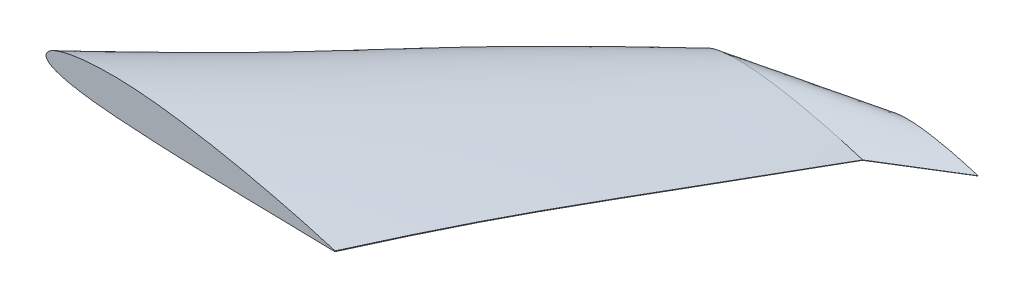
ISO-10303-21;
HEADER;
FILE_DESCRIPTION(('STEP AP214'),'2;1');
FILE_NAME('part.step','',(''),(''),'','','');
FILE_SCHEMA(('AUTOMOTIVE_DESIGN { 1 0 10303 214 1 1 1 1 }'));
ENDSEC;
DATA;
#1=APPLICATION_CONTEXT('core data for automotive mechanical design processes');
#2=APPLICATION_PROTOCOL_DEFINITION('international standard','automotive_design',2000,#1);
#3=PRODUCT_CONTEXT('',#1,'mechanical');
#4=PRODUCT('Part','Part','',(#3));
#5=PRODUCT_RELATED_PRODUCT_CATEGORY('part','',(#4));
#6=PRODUCT_DEFINITION_FORMATION('','',#4);
#7=PRODUCT_DEFINITION_CONTEXT('part definition',#1,'design');
#8=PRODUCT_DEFINITION('design','',#6,#7);
#9=PRODUCT_DEFINITION_SHAPE('','',#8);
#10=(LENGTH_UNIT() NAMED_UNIT(*) SI_UNIT(.MILLI.,.METRE.));
#11=(NAMED_UNIT(*) PLANE_ANGLE_UNIT() SI_UNIT($,.RADIAN.));
#12=(NAMED_UNIT(*) SI_UNIT($,.STERADIAN.) SOLID_ANGLE_UNIT());
#13=UNCERTAINTY_MEASURE_WITH_UNIT(LENGTH_MEASURE(1.E-05),#10,'distance_accuracy_value','');
#14=(GEOMETRIC_REPRESENTATION_CONTEXT(3) GLOBAL_UNCERTAINTY_ASSIGNED_CONTEXT((#13)) GLOBAL_UNIT_ASSIGNED_CONTEXT((#10,
#11,#12)) REPRESENTATION_CONTEXT('',''));
#15=CARTESIAN_POINT('',(0.,0.,0.));
#16=DIRECTION('',(0.,0.,1.));
#17=DIRECTION('',(1.,0.,0.));
#18=AXIS2_PLACEMENT_3D('',#15,#16,#17);
#19=CARTESIAN_POINT('',(0.321211549588751,1.38513605000242,0.));
#20=DIRECTION('',(0.,0.,-1.));
#21=DIRECTION('',(-1.,0.,0.));
#22=AXIS2_PLACEMENT_3D('',#19,#20,#21);
#23=PLANE('',#22);
#24=CARTESIAN_POINT('',(213.493162135836,-18.3985977387796,0.));
#25=CARTESIAN_POINT('',(210.001068508854,-17.358861418454,0.));
#26=CARTESIAN_POINT('',(203.02605295468,-15.2821195606542,0.));
#27=CARTESIAN_POINT('',(189.042387614006,-11.3725974573167,0.));
#28=CARTESIAN_POINT('',(171.520112606889,-6.86338505017849,0.));
#29=CARTESIAN_POINT('',(150.436618758431,-1.93851155160731,0.));
#30=CARTESIAN_POINT('',(129.312241209844,2.47849407440199,0.));
#31=CARTESIAN_POINT('',(108.118882190536,6.21363198308793,0.));
#32=CARTESIAN_POINT('',(86.8776689668776,9.34577660300751,0.));
#33=CARTESIAN_POINT('',(69.0819293463606,11.1183147996094,0.));
#34=CARTESIAN_POINT('',(54.792834861414,11.7745190823262,0.));
#35=CARTESIAN_POINT('',(44.03039723417,11.8458319915289,0.));
#36=CARTESIAN_POINT('',(33.2103727065102,11.4143190106629,0.));
#37=CARTESIAN_POINT('',(24.1576584095502,10.5092531024174,0.));
#38=CARTESIAN_POINT('',(16.891423222456,9.22497315586533,0.));
#39=CARTESIAN_POINT('',(11.3574177018554,7.96357807401569,0.));
#40=CARTESIAN_POINT('',(6.62056207418062,6.34416223062721,0.));
#41=CARTESIAN_POINT('',(2.47282370966279,4.24123989482026,0.));
#42=CARTESIAN_POINT('',(-1.32769035633093,0.309486082961757,0.));
#43=CARTESIAN_POINT('',(1.91001593785473,-3.72198031480986,0.));
#44=CARTESIAN_POINT('',(5.62165750212701,-5.75622948092245,0.));
#45=CARTESIAN_POINT('',(10.0491176639823,-7.44214581087602,0.));
#46=CARTESIAN_POINT('',(15.333006580463,-8.83549991642789,0.));
#47=CARTESIAN_POINT('',(22.3919662078617,-10.2476466023041,0.));
#48=CARTESIAN_POINT('',(31.2362759816886,-11.6329919054533,0.));
#49=CARTESIAN_POINT('',(41.8984815437594,-12.8110098179998,0.));
#50=CARTESIAN_POINT('',(52.5773178664621,-13.7111180719413,0.));
#51=CARTESIAN_POINT('',(66.8373810143671,-14.6421455738428,0.));
#52=CARTESIAN_POINT('',(84.6792224792707,-15.6334614652177,0.));
#53=CARTESIAN_POINT('',(106.113515108805,-16.517367698461,0.));
#54=CARTESIAN_POINT('',(127.567417979444,-17.1058304516163,0.));
#55=CARTESIAN_POINT('',(149.029350711165,-17.6442027773364,0.));
#56=CARTESIAN_POINT('',(170.496353699842,-18.1666577508834,0.));
#57=CARTESIAN_POINT('',(188.389987423759,-18.4835869038475,0.));
#58=CARTESIAN_POINT('',(202.706172144939,-18.7730528543508,0.));
#59=CARTESIAN_POINT('',(209.864963016244,-18.893426097058,0.));
#60=CARTESIAN_POINT('',(213.44460425543,-18.9536168515354,0.));
#61=B_SPLINE_CURVE_WITH_KNOTS('',3,(#24,#25,#26,#27,#28,#29,#30,#31,#32,#33,#34,#35,#36,#37,#38,
#39,#40,#41,#42,#43,#44,#45,#46,#47,#48,#49,#50,#51,#52,#53,#54,#55,#56,#57,#58,#59,#60),
.UNSPECIFIED.,.F.,.F.,(4,1,1,1,1,1,1,1,1,1,1,1,1,1,1,1,1,1,1,1,1,1,1,1,1,1,1,1,1,1,1,1,1,1,4),
(0.,0.025012489715977,0.0499592861627542,0.099672924927269,0.149206319906898,0.198581096612684,
0.247805170454698,0.296916574600785,0.34595272179258,0.370491625538827,0.395091203652992,
0.419814795797951,0.444798575013021,0.457489818920825,0.470406405401129,0.483879408645107,
0.491264120307465,0.50345885330176,0.513609129421187,0.520450990712491,0.533235387638849,
0.545691039129915,0.558031884238607,0.582609167277875,0.607134741746887,0.631652079865866,
0.656174271858889,0.705233949249511,0.754320378529551,0.803437363556193,0.852566095729207,
0.901700994035278,0.950848809338238,0.975422717018713,1.),.UNSPECIFIED.);
#62=CARTESIAN_POINT('',(213.493162135836,-18.3985977387796,0.));
#63=VERTEX_POINT('',#62);
#64=CARTESIAN_POINT('',(213.44460425543,-18.9536168515354,0.));
#65=VERTEX_POINT('',#64);
#66=EDGE_CURVE('E249',#63,#65,#61,.T.);
#67=ORIENTED_EDGE('',*,*,#66,.T.);
#68=DIRECTION('',(0.0871557427475811,0.996194698091752,0.));
#69=VECTOR('',#68,1.);
#70=CARTESIAN_POINT('',(213.493162135836,-18.3985977387796,0.));
#71=LINE('',#70,#69);
#72=EDGE_CURVE('E289',#65,#63,#71,.T.);
#73=ORIENTED_EDGE('',*,*,#72,.T.);
#74=EDGE_LOOP('',(#67,#73));
#75=FACE_BOUND('',#74,.T.);
#76=ADVANCED_FACE('F139',(#75),#23,.F.);
#77=CARTESIAN_POINT('',(213.44460425543,-18.9536168515354,0.));
#78=CARTESIAN_POINT('',(226.808096844784,-19.0985068310262,-30.1209114685854));
#79=CARTESIAN_POINT('',(253.151730999959,-20.5372279174634,-89.5828484519718));
#80=CARTESIAN_POINT('',(295.672549999425,-27.2780798646753,-180.884588738093));
#81=CARTESIAN_POINT('',(320.436853494617,-32.8712028858696,-240.299958510683));
#82=CARTESIAN_POINT('',(332.664741219427,-36.155196465159,-270.51));
#83=CARTESIAN_POINT('',(209.864963016244,-18.893426097058,0.));
#84=CARTESIAN_POINT('',(223.439208628576,-19.0690062797571,-30.1118694506034));
#85=CARTESIAN_POINT('',(250.190661791155,-20.5493633626081,-89.588356523851));
#86=CARTESIAN_POINT('',(293.038204365572,-27.2908852406058,-180.878776656383));
#87=CARTESIAN_POINT('',(318.25109789243,-32.8395313952331,-240.309916443411));
#88=CARTESIAN_POINT('',(330.720624941146,-36.0885524097114,-270.51));
#89=CARTESIAN_POINT('',(202.706172144939,-18.7730528543508,0.));
#90=CARTESIAN_POINT('',(216.701894859634,-19.0100092286525,-30.0937866564175));
#91=CARTESIAN_POINT('',(244.268930029537,-20.5736325862863,-89.599371911163));
#92=CARTESIAN_POINT('',(287.769874883541,-27.3164942338509,-180.867153291161));
#93=CARTESIAN_POINT('',(313.879886866991,-32.7761927635381,-240.3298309413));
#94=CARTESIAN_POINT('',(326.832659378184,-35.9552734513225,-270.51));
#95=CARTESIAN_POINT('',(188.389987423759,-18.4835869038475,0.));
#96=CARTESIAN_POINT('',(203.225660092644,-18.8460119725104,-30.0554871408122));
#97=CARTESIAN_POINT('',(232.427447009702,-20.581948729976,-89.6229197924974));
#98=CARTESIAN_POINT('',(277.231432860306,-27.3317600451655,-180.841779224274));
#99=CARTESIAN_POINT('',(305.141908474588,-32.6199162987263,-240.373641423185));
#100=CARTESIAN_POINT('',(319.0579491942,-35.6622612937244,-270.51));
#101=CARTESIAN_POINT('',(170.496353699842,-18.1666577508834,0.));
#102=CARTESIAN_POINT('',(186.378456138984,-18.6829155403395,-30.0046907279026));
#103=CARTESIAN_POINT('',(217.63011942027,-20.6296404070841,-89.6543629744878));
#104=CARTESIAN_POINT('',(264.057363784191,-27.3836821075579,-180.807388947573));
#105=CARTESIAN_POINT('',(294.225676452568,-32.4522507682554,-240.433337659288));
#106=CARTESIAN_POINT('',(309.340003347809,-35.3204055408254,-270.51));
#107=CARTESIAN_POINT('',(149.029350711165,-17.6442027773364,0.));
#108=CARTESIAN_POINT('',(166.159445189979,-18.3530602438073,-29.9397424431826));
#109=CARTESIAN_POINT('',(199.879482070139,-20.5694195871649,-89.6949870933212));
#110=CARTESIAN_POINT('',(248.244945909805,-27.3412270497817,-180.761953223257));
#111=CARTESIAN_POINT('',(281.138701288123,-32.1643944782056,-240.512826521095));
#112=CARTESIAN_POINT('',(297.682726723304,-34.8330100270144,-270.51));
#113=CARTESIAN_POINT('',(127.567417979444,-17.1058304516163,0.));
#114=CARTESIAN_POINT('',(145.938747952749,-18.0077020436872,-29.871348840303));
#115=CARTESIAN_POINT('',(182.136931298814,-20.4961926979434,-89.7380473040313));
#116=CARTESIAN_POINT('',(232.430855453409,-27.2868513388757,-180.71312924487));
#117=CARTESIAN_POINT('',(268.06409993125,-31.8669537120474,-240.59864344446));
#118=CARTESIAN_POINT('',(286.028355521747,-34.3370152825756,-270.51));
#119=CARTESIAN_POINT('',(106.113515108805,-16.517367698461,0.));
#120=CARTESIAN_POINT('',(125.71892876727,-17.614704489188,-29.8001672423866));
#121=CARTESIAN_POINT('',(164.404322404519,-20.3816131802694,-89.783118235977));
#122=CARTESIAN_POINT('',(216.61667147407,-27.1954352741888,-180.661426348622));
#123=CARTESIAN_POINT('',(255.003756894997,-31.5389260570607,-240.689877094331));
#124=CARTESIAN_POINT('',(274.378821639675,-33.8138844012241,-270.51));
#125=CARTESIAN_POINT('',(84.6792224792707,-15.6334614652177,0.));
#126=CARTESIAN_POINT('',(105.509346102794,-16.943258644689,-29.7271451391366));
#127=CARTESIAN_POINT('',(146.686876944261,-20.0225044917396,-89.8296878387623));
#128=CARTESIAN_POINT('',(200.806912325959,-26.8863902274838,-180.607226976457));
#129=CARTESIAN_POINT('',(241.964677139842,-31.0303333311121,-240.785973182691));
#130=CARTESIAN_POINT('',(262.742742878064,-33.1304359325888,-270.51));
#131=CARTESIAN_POINT('',(66.8373810143671,-14.6421455738428,0.));
#132=CARTESIAN_POINT('',(88.680155119488,-16.1435581481664,-29.665193716984));
#133=CARTESIAN_POINT('',(131.937823630785,-19.5124000853021,-89.8694371389661));
#134=CARTESIAN_POINT('',(187.63847781841,-26.4411304146597,-180.560409644206));
#135=CARTESIAN_POINT('',(231.118650537765,-30.450878269758,-240.86930300641));
#136=CARTESIAN_POINT('',(253.059328857979,-32.4227018698297,-270.51));
#137=CARTESIAN_POINT('',(52.5773178664621,-13.7111180719413,0.));
#138=CARTESIAN_POINT('',(75.225570868701,-15.3736280865817,-29.6151835173551));
#139=CARTESIAN_POINT('',(120.14919970514,-18.9901001331615,-89.9016413017934));
#140=CARTESIAN_POINT('',(177.108869405948,-25.9831776004608,-180.52221075209));
#141=CARTESIAN_POINT('',(222.454470862925,-29.9030457869019,-240.937446665529));
#142=CARTESIAN_POINT('',(245.321191185881,-31.7816851692629,-270.51));
#143=CARTESIAN_POINT('',(41.8984815437594,-12.8110098179998,0.));
#144=CARTESIAN_POINT('',(65.1471129123641,-14.6060590681288,-29.5777003857977));
#145=CARTESIAN_POINT('',(111.318550752846,-18.4312273330097,-89.9258946896544));
#146=CARTESIAN_POINT('',(169.2190597598,-25.4909586094437,-180.493176527556));
#147=CARTESIAN_POINT('',(215.968420441766,-29.3689171261344,-240.989392711705));
#148=CARTESIAN_POINT('',(239.52830875517,-31.1914254299696,-270.51));
#149=CARTESIAN_POINT('',(31.2362759816886,-11.6329919054533,0.));
#150=CARTESIAN_POINT('',(55.0810493710142,-13.5767764712723,-29.5403728747809));
#151=CARTESIAN_POINT('',(102.497719704603,-17.6423042735928,-89.9501913193148));
#152=CARTESIAN_POINT('',(161.335713941218,-24.7939912924803,-180.463762055835));
#153=CARTESIAN_POINT('',(209.494691629451,-28.6651363346335,-241.042204225549));
#154=CARTESIAN_POINT('',(233.747096535235,-30.4503453283636,-270.51));
#155=CARTESIAN_POINT('',(22.3919662078617,-10.2476466023041,0.));
#156=CARTESIAN_POINT('',(46.72733261966,-12.3388412121923,-29.5097178115773));
#157=CARTESIAN_POINT('',(95.1744734426118,-16.6504076574947,-89.9703378765657));
#158=CARTESIAN_POINT('',(154.788723796964,-23.9155078318639,-180.438933867986));
#159=CARTESIAN_POINT('',(204.126587810928,-27.8322581718008,-241.087025513361));
#160=CARTESIAN_POINT('',(228.955446065209,-29.6138704503522,-270.51));
#161=CARTESIAN_POINT('',(15.333006580463,-8.83549991642789,0.));
#162=CARTESIAN_POINT('',(40.0571856669367,-11.0623737768314,-29.485503421075));
#163=CARTESIAN_POINT('',(89.3246327129247,-15.6053789638177,-89.9863894594341));
#164=CARTESIAN_POINT('',(149.55767131691,-22.9888315898962,-180.418842515318));
#165=CARTESIAN_POINT('',(199.843237138191,-26.9805564599104,-241.123465178537));
#166=CARTESIAN_POINT('',(225.133964625653,-28.7797652969111,-270.51));
#167=CARTESIAN_POINT('',(10.0491176639823,-7.44214581087602,0.));
#168=CARTESIAN_POINT('',(35.0617267783121,-9.79043134915362,-29.4677085506585));
#169=CARTESIAN_POINT('',(84.9401698636423,-14.5450554936669,-89.9983382225426));
#170=CARTESIAN_POINT('',(145.636163169799,-22.0477041173477,-180.403546529037));
#171=CARTESIAN_POINT('',(196.637601869288,-26.1378283141612,-241.151390802638));
#172=CARTESIAN_POINT('',(222.276635424862,-27.9727019096837,-270.51));
#173=CARTESIAN_POINT('',(5.62165750212701,-5.75622948092245,0.));
#174=CARTESIAN_POINT('',(30.8721394607898,-8.23686058305934,-29.4533117454657));
#175=CARTESIAN_POINT('',(81.2575112975548,-13.227945492301,-90.0082406730307));
#176=CARTESIAN_POINT('',(142.341390104415,-20.8776368441598,-180.390352429633));
#177=CARTESIAN_POINT('',(193.952157374802,-25.1154212238322,-241.175751916914));
#178=CARTESIAN_POINT('',(219.887346654475,-27.0148215081194,-270.51));
#179=CARTESIAN_POINT('',(1.91001593785473,-3.72198031480986,0.));
#180=CARTESIAN_POINT('',(27.3555168688809,-6.35026448509988,-29.4418685243196));
#181=CARTESIAN_POINT('',(78.1595519491263,-11.610356591811,-90.0164048094429));
#182=CARTESIAN_POINT('',(139.568818031533,-19.4398435892677,-180.37884495501));
#183=CARTESIAN_POINT('',(191.70136179549,-23.8794880701168,-241.197317719164));
#184=CARTESIAN_POINT('',(217.89023885822,-25.8744926130289,-270.51));
#185=CARTESIAN_POINT('',(-1.32769035633093,0.309486082961757,0.));
#186=CARTESIAN_POINT('',(24.2723794177701,-2.58108983845155,-29.4341627821699));
#187=CARTESIAN_POINT('',(75.4179799464546,-8.33300444034477,-90.0230247103526));
#188=CARTESIAN_POINT('',(137.112511217179,-16.5248427030007,-180.36719131359));
#189=CARTESIAN_POINT('',(189.739031515539,-21.4243554322063,-241.220269444897));
#190=CARTESIAN_POINT('',(216.169541610647,-23.6536434467886,-270.51));
#191=CARTESIAN_POINT('',(2.47282370966279,4.24123989482026,0.));
#192=CARTESIAN_POINT('',(27.8321434983078,1.14557711871067,-29.4520050136477));
#193=CARTESIAN_POINT('',(78.4854170543147,-5.01538049920095,-90.0133487852689));
#194=CARTESIAN_POINT('',(139.851217035394,-13.5714376090695,-180.374509569159));
#195=CARTESIAN_POINT('',(192.045845461364,-19.019662396172,-241.209580174115));
#196=CARTESIAN_POINT('',(218.271504333298,-21.5537057330432,-270.51));
#197=CARTESIAN_POINT('',(6.62056207418062,6.34416223062721,0.));
#198=CARTESIAN_POINT('',(31.7318871000412,3.15406606464514,-29.4692972900627));
#199=CARTESIAN_POINT('',(81.8713054159453,-3.20394357713273,-90.0032707663942));
#200=CARTESIAN_POINT('',(142.876485690284,-11.9583357151077,-180.384038907063));
#201=CARTESIAN_POINT('',(194.562853617916,-17.7301289974087,-241.193959989346));
#202=CARTESIAN_POINT('',(220.544758962504,-20.450597324446,-270.51));
#203=CARTESIAN_POINT('',(11.3574177018554,7.96357807401569,0.));
#204=CARTESIAN_POINT('',(36.1906703756147,4.71190884545711,-29.4882743333626));
#205=CARTESIAN_POINT('',(85.7518440406682,-1.78202247284359,-89.9919301500034));
#206=CARTESIAN_POINT('',(146.344331876129,-10.6917194382635,-180.3954733322));
#207=CARTESIAN_POINT('',(197.437351115768,-16.7346181610685,-241.174709488761));
#208=CARTESIAN_POINT('',(223.133474327351,-19.6157465769568,-270.51));
#209=CARTESIAN_POINT('',(16.891423222456,9.22497315586533,0.));
#210=CARTESIAN_POINT('',(41.4037544033393,5.93865439359099,-29.5098258700957));
#211=CARTESIAN_POINT('',(90.2966346334072,-0.642199699394139,-89.9788236549245));
#212=CARTESIAN_POINT('',(150.405999494403,-9.67598498114478,-180.409250072304));
#213=CARTESIAN_POINT('',(200.795869774023,-15.9561859505289,-241.151139566895));
#214=CARTESIAN_POINT('',(226.15185682488,-18.9829544311304,-270.51));
#215=CARTESIAN_POINT('',(24.1576584095502,10.5092531024174,0.));
#216=CARTESIAN_POINT('',(48.2506955341338,7.19943504012599,-29.5377460479744));
#217=CARTESIAN_POINT('',(96.2707895786026,0.546848895149865,-89.9617136780078));
#218=CARTESIAN_POINT('',(155.744866337919,-8.61605561415777,-180.427551686918));
#219=CARTESIAN_POINT('',(205.206183342822,-15.1609321486315,-241.11962498644));
#220=CARTESIAN_POINT('',(230.111512816361,-18.3541559844547,-270.51));
#221=CARTESIAN_POINT('',(33.2103727065102,11.4143190106629,0.));
#222=CARTESIAN_POINT('',(56.7849306180551,8.11638641455893,-29.5718229410723));
#223=CARTESIAN_POINT('',(103.726402272965,1.45354999423792,-89.9405763891891));
#224=CARTESIAN_POINT('',(162.407253869805,-7.80697135235513,-180.450774028335));
#225=CARTESIAN_POINT('',(210.701796805123,-14.594053908074,-241.079250465321));
#226=CARTESIAN_POINT('',(235.03810104294,-17.9483111701662,-270.51));
#227=CARTESIAN_POINT('',(44.03039723417,11.8458319915289,0.));
#228=CARTESIAN_POINT('',(66.988320771399,8.60072814675958,-29.6118060592754));
#229=CARTESIAN_POINT('',(112.64975703288,1.99950123944253,-89.9155395072801));
#230=CARTESIAN_POINT('',(170.380017786137,-7.31842836102958,-180.478842616847));
#231=CARTESIAN_POINT('',(217.272087040934,-14.313163532249,-241.030105057239));
#232=CARTESIAN_POINT('',(240.9203131729,-17.8164890543747,-270.51));
#233=CARTESIAN_POINT('',(54.792834861414,11.7745190823262,0.));
#234=CARTESIAN_POINT('',(77.1394372249794,8.61179257551283,-29.6509093221915));
#235=CARTESIAN_POINT('',(121.535248508616,2.12854625341237,-89.8908684220633));
#236=CARTESIAN_POINT('',(178.317550207913,-7.2007600741049,-180.506937745458));
#237=CARTESIAN_POINT('',(223.809298715694,-14.3391748960476,-240.980650372623));
#238=CARTESIAN_POINT('',(246.766472320462,-17.9572876188258,-270.51));
#239=CARTESIAN_POINT('',(69.0819293463606,11.1183147996094,0.));
#240=CARTESIAN_POINT('',(90.6188617151628,8.09855075294501,-29.7019468284789));
#241=CARTESIAN_POINT('',(133.343365800598,1.83535173390717,-89.8584526904276));
#242=CARTESIAN_POINT('',(188.86388054634,-7.45761284054342,-180.544355763862));
#243=CARTESIAN_POINT('',(232.491246564879,-14.7164553122543,-240.914486717712));
#244=CARTESIAN_POINT('',(254.522987711342,-18.4492782966307,-270.51));
#245=CARTESIAN_POINT('',(86.8776689668776,9.34577660300751,0.));
#246=CARTESIAN_POINT('',(107.409226736283,6.56142997159434,-29.7637685946464));
#247=CARTESIAN_POINT('',(148.068255431608,0.679790507571521,-89.8188015133623));
#248=CARTESIAN_POINT('',(202.011319897692,-8.48010599681543,-180.591023157234));
#249=CARTESIAN_POINT('',(243.308844578862,-15.769675828439,-240.831443458825));
#250=CARTESIAN_POINT('',(264.17394820862,-19.5809844524823,-270.51));
#251=CARTESIAN_POINT('',(108.118882190536,6.21363198308793,0.));
#252=CARTESIAN_POINT('',(127.451542285299,3.77199684893263,-29.8346162831003));
#253=CARTESIAN_POINT('',(165.665639016155,-1.54089661418416,-89.77292492135));
#254=CARTESIAN_POINT('',(217.716280562928,-10.4477108116265,-180.646022223253));
#255=CARTESIAN_POINT('',(256.229474258962,-17.6482025949362,-240.732998217942));
#256=CARTESIAN_POINT('',(275.683814696558,-21.483986996691,-270.51));
#257=CARTESIAN_POINT('',(129.312241209844,2.47849407440199,0.));
#258=CARTESIAN_POINT('',(147.446892096838,0.416479714838476,-29.9020983694875));
#259=CARTESIAN_POINT('',(183.237996092433,-4.26196706551821,-89.7289558798668));
#260=CARTESIAN_POINT('',(233.390940176478,-12.8589165460225,-180.699354254958));
#261=CARTESIAN_POINT('',(269.130051587405,-19.8961265493469,-240.637187998918));
#262=CARTESIAN_POINT('',(287.161965760192,-23.7141197663076,-270.51));
#263=CARTESIAN_POINT('',(150.436618758431,-1.93851155160731,0.));
#264=CARTESIAN_POINT('',(167.375884901825,-3.57924815155003,-29.9653338755377));
#265=CARTESIAN_POINT('',(200.769283464302,-7.54917812718644,-89.6874012911588));
#266=CARTESIAN_POINT('',(249.020955278472,-15.7718678286903,-180.750556507774));
#267=CARTESIAN_POINT('',(281.99788454996,-22.5620323092707,-240.544759499859));
#268=CARTESIAN_POINT('',(298.596175793006,-26.314031985672,-270.51));
#269=CARTESIAN_POINT('',(171.520112606889,-6.86338505017849,0.));
#270=CARTESIAN_POINT('',(187.263818984535,-8.05128764747896,-30.0238669826242));
#271=CARTESIAN_POINT('',(218.279687045058,-11.2581707918702,-89.6486384996625));
#272=CARTESIAN_POINT('',(264.624095253316,-19.0580130936233,-180.798989188702));
#273=CARTESIAN_POINT('',(294.850205365178,-25.5398666723514,-240.456963402055));
#274=CARTESIAN_POINT('',(310.003359264463,-29.1894623997113,-270.51));
#275=CARTESIAN_POINT('',(189.042387614006,-11.3725974573167,0.));
#276=CARTESIAN_POINT('',(203.790287695272,-12.157968040436,-30.0679533372278));
#277=CARTESIAN_POINT('',(232.843055646323,-14.6858134585656,-89.6191677826246));
#278=CARTESIAN_POINT('',(277.59421503843,-22.0942784702794,-180.836425182103));
#279=CARTESIAN_POINT('',(305.539606084096,-28.2705249128329,-240.38877021347));
#280=CARTESIAN_POINT('',(319.479805482923,-31.8053095298452,-270.51));
#281=CARTESIAN_POINT('',(203.02605295468,-15.2821195606542,0.));
#282=CARTESIAN_POINT('',(216.978619464999,-15.7268894786325,-30.1000759239574));
#283=CARTESIAN_POINT('',(244.472656720497,-17.6789826130632,-89.5974647705209));
#284=CARTESIAN_POINT('',(287.947733146614,-24.7454693257025,-180.864501656619));
#285=CARTESIAN_POINT('',(314.074744390734,-30.6406962186505,-240.337356616732));
#286=CARTESIAN_POINT('',(327.039542271674,-34.0618114888501,-270.51));
#287=CARTESIAN_POINT('',(210.001068508854,-17.358861418454,0.));
#288=CARTESIAN_POINT('',(223.556604817153,-17.6258355954638,-30.1146313483442));
#289=CARTESIAN_POINT('',(250.276489253839,-19.2769889067867,-89.587521628994));
#290=CARTESIAN_POINT('',(293.113073721349,-26.160778370804,-180.877603105043));
#291=CARTESIAN_POINT('',(318.333993506631,-31.900790498768,-240.313240949463));
#292=CARTESIAN_POINT('',(330.809117840616,-35.2561706694631,-270.51));
#293=CARTESIAN_POINT('',(213.493162135836,-18.3985977387796,0.));
#294=CARTESIAN_POINT('',(226.849922308452,-18.5765571502855,-30.1219186302642));
#295=CARTESIAN_POINT('',(253.182221354984,-20.077042691735,-89.5825435209325));
#296=CARTESIAN_POINT('',(295.699140055127,-26.869363413837,-180.884162443039));
#297=CARTESIAN_POINT('',(320.466418384803,-32.5316661105596,-240.301167260548));
#298=CARTESIAN_POINT('',(332.696384000596,-35.8541355127746,-270.51));
#299=B_SPLINE_SURFACE_WITH_KNOTS('',3,3,((#77,#78,#79,#80,#81,#82),(#83,#84,#85,#86,#87,#88),
(#89,#90,#91,#92,#93,#94),(#95,#96,#97,#98,#99,#100),(#101,#102,#103,#104,#105,#106),(#107,#108,
#109,#110,#111,#112),(#113,#114,#115,#116,#117,#118),(#119,#120,#121,#122,#123,#124),(#125,#126,
#127,#128,#129,#130),(#131,#132,#133,#134,#135,#136),(#137,#138,#139,#140,#141,#142),(#143,#144,
#145,#146,#147,#148),(#149,#150,#151,#152,#153,#154),(#155,#156,#157,#158,#159,#160),(#161,#162,
#163,#164,#165,#166),(#167,#168,#169,#170,#171,#172),(#173,#174,#175,#176,#177,#178),(#179,#180,
#181,#182,#183,#184),(#185,#186,#187,#188,#189,#190),(#191,#192,#193,#194,#195,#196),(#197,#198,
#199,#200,#201,#202),(#203,#204,#205,#206,#207,#208),(#209,#210,#211,#212,#213,#214),(#215,#216,
#217,#218,#219,#220),(#221,#222,#223,#224,#225,#226),(#227,#228,#229,#230,#231,#232),(#233,#234,
#235,#236,#237,#238),(#239,#240,#241,#242,#243,#244),(#245,#246,#247,#248,#249,#250),(#251,#252,
#253,#254,#255,#256),(#257,#258,#259,#260,#261,#262),(#263,#264,#265,#266,#267,#268),(#269,#270,
#271,#272,#273,#274),(#275,#276,#277,#278,#279,#280),(#281,#282,#283,#284,#285,#286),(#287,#288,
#289,#290,#291,#292),(#293,#294,#295,#296,#297,#298)),.UNSPECIFIED.,.F.,.F.,.F.,(4,1,1,1,1,1,1,
1,1,1,1,1,1,1,1,1,1,1,1,1,1,1,1,1,1,1,1,1,1,1,1,1,1,1,4),(4,1,1,4),(0.,0.0245772829812873,
0.0491511906617618,0.0982990059647219,0.147433904270793,0.196562636443807,0.245679621470449,
0.294766050750489,0.343825728141111,0.368347920134133,0.392865258253113,0.417390832722125,
0.441968115761393,0.454308960870085,0.466764612361151,0.479549009287509,0.486390870578813,
0.49654114669824,0.508735879692535,0.516120591354893,0.529593594598871,0.542510181079175,
0.555201424986979,0.580185204202049,0.604908796347008,0.629508374461173,0.65404727820742,
0.703083425399215,0.752194829545302,0.801418903387316,0.850793680093102,0.900327075072731,
0.950040713837246,0.974987510284023,1.),(0.,0.334413802479807,0.666065331399457,1.),.UNSPECIFIED.);
#300=CARTESIAN_POINT('',(213.493162135836,-18.3985977387796,0.));
#301=CARTESIAN_POINT('',(226.849922308452,-18.5765571502855,-30.1219186302642));
#302=CARTESIAN_POINT('',(253.182221354984,-20.077042691735,-89.5825435209325));
#303=CARTESIAN_POINT('',(295.699140055127,-26.869363413837,-180.884162443039));
#304=CARTESIAN_POINT('',(320.466418384803,-32.5316661105596,-240.301167260548));
#305=CARTESIAN_POINT('',(332.696384000596,-35.8541355127746,-270.51));
#306=B_SPLINE_CURVE_WITH_KNOTS('',3,(#300,#301,#302,#303,#304,#305),.UNSPECIFIED.,.F.,.F.,(4,1,
1,4),(0.,0.334413802479807,0.666065331399457,1.),.UNSPECIFIED.);
#307=CARTESIAN_POINT('',(332.696384000596,-35.8541355127746,-270.51));
#308=VERTEX_POINT('',#307);
#309=EDGE_CURVE('E286',#63,#308,#306,.T.);
#310=CARTESIAN_POINT('',(332.696384000596,-35.8541355127746,-270.51));
#311=CARTESIAN_POINT('',(330.809117840616,-35.2561706694631,-270.51));
#312=CARTESIAN_POINT('',(327.039542271674,-34.0618114888501,-270.51));
#313=CARTESIAN_POINT('',(319.479805482923,-31.8053095298452,-270.51));
#314=CARTESIAN_POINT('',(310.003359264463,-29.1894623997113,-270.51));
#315=CARTESIAN_POINT('',(298.596175793006,-26.314031985672,-270.51));
#316=CARTESIAN_POINT('',(287.161965760192,-23.7141197663076,-270.51));
#317=CARTESIAN_POINT('',(275.683814696558,-21.483986996691,-270.51));
#318=CARTESIAN_POINT('',(264.17394820862,-19.5809844524823,-270.51));
#319=CARTESIAN_POINT('',(254.522987711342,-18.4492782966307,-270.51));
#320=CARTESIAN_POINT('',(246.766472320462,-17.9572876188258,-270.51));
#321=CARTESIAN_POINT('',(240.9203131729,-17.8164890543747,-270.51));
#322=CARTESIAN_POINT('',(235.03810104294,-17.9483111701662,-270.51));
#323=CARTESIAN_POINT('',(230.111512816361,-18.3541559844547,-270.51));
#324=CARTESIAN_POINT('',(226.15185682488,-18.9829544311304,-270.51));
#325=CARTESIAN_POINT('',(223.133474327351,-19.6157465769568,-270.51));
#326=CARTESIAN_POINT('',(220.544758962504,-20.450597324446,-270.51));
#327=CARTESIAN_POINT('',(218.271504333298,-21.5537057330432,-270.51));
#328=CARTESIAN_POINT('',(216.169541610647,-23.6536434467886,-270.51));
#329=CARTESIAN_POINT('',(217.89023885822,-25.8744926130289,-270.51));
#330=CARTESIAN_POINT('',(219.887346654475,-27.0148215081194,-270.51));
#331=CARTESIAN_POINT('',(222.276635424862,-27.9727019096837,-270.51));
#332=CARTESIAN_POINT('',(225.133964625653,-28.7797652969111,-270.51));
#333=CARTESIAN_POINT('',(228.955446065209,-29.6138704503522,-270.51));
#334=CARTESIAN_POINT('',(233.747096535235,-30.4503453283636,-270.51));
#335=CARTESIAN_POINT('',(239.52830875517,-31.1914254299696,-270.51));
#336=CARTESIAN_POINT('',(245.321191185881,-31.7816851692629,-270.51));
#337=CARTESIAN_POINT('',(253.059328857979,-32.4227018698297,-270.51));
#338=CARTESIAN_POINT('',(262.742742878064,-33.1304359325888,-270.51));
#339=CARTESIAN_POINT('',(274.378821639675,-33.8138844012241,-270.51));
#340=CARTESIAN_POINT('',(286.028355521747,-34.3370152825756,-270.51));
#341=CARTESIAN_POINT('',(297.682726723304,-34.8330100270144,-270.51));
#342=CARTESIAN_POINT('',(309.340003347809,-35.3204055408254,-270.51));
#343=CARTESIAN_POINT('',(319.0579491942,-35.6622612937244,-270.51));
#344=CARTESIAN_POINT('',(326.832659378184,-35.9552734513225,-270.51));
#345=CARTESIAN_POINT('',(330.720624941146,-36.0885524097114,-270.51));
#346=CARTESIAN_POINT('',(332.664741219427,-36.155196465159,-270.51));
#347=B_SPLINE_CURVE_WITH_KNOTS('',3,(#310,#311,#312,#313,#314,#315,#316,#317,#318,#319,#320,
#321,#322,#323,#324,#325,#326,#327,#328,#329,#330,#331,#332,#333,#334,#335,#336,#337,#338,#339,
#340,#341,#342,#343,#344,#345,#346),.UNSPECIFIED.,.F.,.F.,(4,1,1,1,1,1,1,1,1,1,1,1,1,1,1,1,1,1,
1,1,1,1,1,1,1,1,1,1,1,1,1,1,1,1,4),(0.,0.025012489715977,0.0499592861627542,0.099672924927269,
0.149206319906898,0.198581096612684,0.247805170454698,0.296916574600785,0.34595272179258,
0.370491625538827,0.395091203652992,0.419814795797951,0.444798575013021,0.457489818920825,
0.470406405401129,0.483879408645107,0.491264120307465,0.50345885330176,0.513609129421187,
0.520450990712491,0.533235387638849,0.545691039129915,0.558031884238607,0.582609167277875,
0.607134741746887,0.631652079865866,0.656174271858889,0.705233949249511,0.754320378529551,
0.803437363556193,0.852566095729207,0.901700994035278,0.950848809338238,0.975422717018713,1.),.UNSPECIFIED.);
#348=CARTESIAN_POINT('',(332.664741219427,-36.155196465159,-270.51));
#349=VERTEX_POINT('',#348);
#350=EDGE_CURVE('E153',#308,#349,#347,.T.);
#351=CARTESIAN_POINT('',(213.44460425543,-18.9536168515354,0.));
#352=CARTESIAN_POINT('',(226.808096844784,-19.0985068310262,-30.1209114685854));
#353=CARTESIAN_POINT('',(253.151730999959,-20.5372279174634,-89.5828484519718));
#354=CARTESIAN_POINT('',(295.672549999425,-27.2780798646753,-180.884588738093));
#355=CARTESIAN_POINT('',(320.436853494617,-32.8712028858696,-240.299958510683));
#356=CARTESIAN_POINT('',(332.664741219427,-36.155196465159,-270.51));
#357=B_SPLINE_CURVE_WITH_KNOTS('',3,(#351,#352,#353,#354,#355,#356),.UNSPECIFIED.,.F.,.F.,(4,1,
1,4),(0.,0.334413802479807,0.666065331399457,1.),.UNSPECIFIED.);
#358=EDGE_CURVE('E169',#349,#65,#357,.F.);
#359=ORIENTED_EDGE('',*,*,#66,.F.);
#360=ORIENTED_EDGE('',*,*,#309,.T.);
#361=ORIENTED_EDGE('',*,*,#350,.T.);
#362=ORIENTED_EDGE('',*,*,#358,.T.);
#363=EDGE_LOOP('',(#359,#360,#361,#362));
#364=FACE_BOUND('',#363,.T.);
#365=ADVANCED_FACE('F263',(#364),#299,.T.);
#366=CARTESIAN_POINT('',(213.493162135836,-18.3985977387796,0.));
#367=CARTESIAN_POINT('',(226.849922308452,-18.5765571502855,-30.1219186302641));
#368=CARTESIAN_POINT('',(253.182221354984,-20.077042691735,-89.5825435209325));
#369=CARTESIAN_POINT('',(295.699140055127,-26.869363413837,-180.884162443039));
#370=CARTESIAN_POINT('',(320.466418384803,-32.5316661105596,-240.301167260548));
#371=CARTESIAN_POINT('',(332.696384000596,-35.8541355127746,-270.51));
#372=CARTESIAN_POINT('',(213.476976175701,-18.5836041096982,0.));
#373=CARTESIAN_POINT('',(226.83598048723,-18.7505403771991,-30.1215829097046));
#374=CARTESIAN_POINT('',(253.172057903309,-20.2304377669778,-89.5826451646123));
#375=CARTESIAN_POINT('',(295.690276703226,-27.0056022307831,-180.884304541391));
#376=CARTESIAN_POINT('',(320.456563421408,-32.6448450356629,-240.300764343926));
#377=CARTESIAN_POINT('',(332.685836406873,-35.9544891635694,-270.51));
#378=CARTESIAN_POINT('',(213.460790215565,-18.7686104806168,0.));
#379=CARTESIAN_POINT('',(226.822038666007,-18.9245236041127,-30.121247189145));
#380=CARTESIAN_POINT('',(253.161894451634,-20.3838328422206,-89.5827468082921));
#381=CARTESIAN_POINT('',(295.681413351326,-27.1418410477292,-180.884446639742));
#382=CARTESIAN_POINT('',(320.446708458012,-32.7580239607663,-240.300361427305));
#383=CARTESIAN_POINT('',(332.67528881315,-36.0548428143642,-270.51));
#384=CARTESIAN_POINT('',(213.44460425543,-18.9536168515354,0.));
#385=CARTESIAN_POINT('',(226.808096844784,-19.0985068310262,-30.1209114685854));
#386=CARTESIAN_POINT('',(253.151730999959,-20.5372279174634,-89.5828484519718));
#387=CARTESIAN_POINT('',(295.672549999425,-27.2780798646753,-180.884588738093));
#388=CARTESIAN_POINT('',(320.436853494617,-32.8712028858696,-240.299958510683));
#389=CARTESIAN_POINT('',(332.664741219427,-36.155196465159,-270.51));
#390=B_SPLINE_SURFACE_WITH_KNOTS('',3,3,((#366,#367,#368,#369,#370,#371),(#372,#373,#374,#375,
#376,#377),(#378,#379,#380,#381,#382,#383),(#384,#385,#386,#387,#388,#389)),.UNSPECIFIED.,.F.,
.F.,.F.,(4,4),(4,1,1,4),(0.,1.),(0.,0.334413802479807,0.666065331399457,1.),.UNSPECIFIED.);
#391=DIRECTION('',(0.104528463267716,0.994521895368267,0.));
#392=VECTOR('',#391,1.);
#393=CARTESIAN_POINT('',(332.696384000596,-35.8541355127746,-270.51));
#394=LINE('',#393,#392);
#395=EDGE_CURVE('E12',#349,#308,#394,.T.);
#396=ORIENTED_EDGE('',*,*,#72,.F.);
#397=ORIENTED_EDGE('',*,*,#358,.F.);
#398=ORIENTED_EDGE('',*,*,#395,.T.);
#399=ORIENTED_EDGE('',*,*,#309,.F.);
#400=EDGE_LOOP('',(#396,#397,#398,#399));
#401=FACE_BOUND('',#400,.T.);
#402=ADVANCED_FACE('F141',(#401),#390,.T.);
#403=CARTESIAN_POINT('',(316.418046425661,-31.6612934644764,-306.07));
#404=DIRECTION('',(0.,0.,1.));
#405=DIRECTION('',(1.,0.,0.));
#406=AXIS2_PLACEMENT_3D('',#403,#404,#405);
#407=PLANE('',#406);
#408=CARTESIAN_POINT('',(382.30389724592,-39.1113518898301,-306.07));
#409=CARTESIAN_POINT('',(381.1957509673,-39.0733647782249,-306.07));
#410=CARTESIAN_POINT('',(378.979610596411,-38.9973957719432,-306.07));
#411=CARTESIAN_POINT('',(374.548025791541,-38.8303788421123,-306.07));
#412=CARTESIAN_POINT('',(369.008796659098,-38.6355210629599,-306.07));
#413=CARTESIAN_POINT('',(362.36414898313,-38.3577056200876,-306.07));
#414=CARTESIAN_POINT('',(355.721157398243,-38.0749886157575,-306.07));
#415=CARTESIAN_POINT('',(349.080923085461,-37.7768040133871,-306.07));
#416=CARTESIAN_POINT('',(342.448358191343,-37.387238386265,-306.07));
#417=CARTESIAN_POINT('',(336.928812199895,-36.9838299704924,-306.07));
#418=CARTESIAN_POINT('',(332.518073726799,-36.6184504511693,-306.07));
#419=CARTESIAN_POINT('',(329.216130741294,-36.2820023997721,-306.07));
#420=CARTESIAN_POINT('',(325.920839775931,-35.8595867418567,-306.07));
#421=CARTESIAN_POINT('',(323.189599008016,-35.3827960613902,-306.07));
#422=CARTESIAN_POINT('',(321.011354587469,-34.9073561239287,-306.07));
#423=CARTESIAN_POINT('',(319.382676943018,-34.4473299932091,-306.07));
#424=CARTESIAN_POINT('',(318.020782343898,-33.9013381643175,-306.07));
#425=CARTESIAN_POINT('',(316.882430900032,-33.2513506941159,-306.07));
#426=CARTESIAN_POINT('',(315.901633468915,-31.9854666693589,-306.07));
#427=CARTESIAN_POINT('',(317.099752220826,-30.7885021725241,-306.07));
#428=CARTESIAN_POINT('',(318.395507359474,-30.1597303796236,-306.07));
#429=CARTESIAN_POINT('',(319.871075117437,-29.6838654535548,-306.07));
#430=CARTESIAN_POINT('',(321.591553141028,-29.3231739304337,-306.07));
#431=CARTESIAN_POINT('',(323.848557056173,-28.9647588158286,-306.07));
#432=CARTESIAN_POINT('',(326.656712345323,-28.7334272716842,-306.07));
#433=CARTESIAN_POINT('',(330.009573259399,-28.658288665683,-306.07));
#434=CARTESIAN_POINT('',(333.34188397351,-28.7385438474201,-306.07));
#435=CARTESIAN_POINT('',(337.763097746312,-29.0189785337689,-306.07));
#436=CARTESIAN_POINT('',(343.26414522976,-29.6640510426044,-306.07));
#437=CARTESIAN_POINT('',(349.824769127884,-30.7487624928033,-306.07));
#438=CARTESIAN_POINT('',(356.367315234156,-32.0199381714847,-306.07));
#439=CARTESIAN_POINT('',(362.88481495286,-33.5018881365225,-306.07));
#440=CARTESIAN_POINT('',(369.38690953159,-35.1408834725249,-306.07));
#441=CARTESIAN_POINT('',(374.788483876113,-36.6319163367012,-306.07));
#442=CARTESIAN_POINT('',(379.097533845701,-37.918122453334,-306.07));
#443=CARTESIAN_POINT('',(381.246191919998,-38.5989071862834,-306.07));
#444=CARTESIAN_POINT('',(382.321933631186,-38.9397471469709,-306.07));
#445=B_SPLINE_CURVE_WITH_KNOTS('',3,(#408,#409,#410,#411,#412,#413,#414,#415,#416,#417,#418,
#419,#420,#421,#422,#423,#424,#425,#426,#427,#428,#429,#430,#431,#432,#433,#434,#435,#436,#437,
#438,#439,#440,#441,#442,#443,#444),.UNSPECIFIED.,.F.,.F.,(4,1,1,1,1,1,1,1,1,1,1,1,1,1,1,1,1,1,
1,1,1,1,1,1,1,1,1,1,1,1,1,1,1,1,4),(0.,0.0245772829812873,0.0491511906617618,0.0982990059647219,
0.147433904270793,0.196562636443807,0.245679621470449,0.294766050750489,0.343825728141111,
0.368347920134133,0.392865258253113,0.417390832722125,0.441968115761393,0.454308960870085,
0.466764612361151,0.479549009287509,0.486390870578813,0.49654114669824,0.508735879692535,
0.516120591354893,0.529593594598871,0.542510181079175,0.555201424986979,0.580185204202049,
0.604908796347008,0.629508374461173,0.65404727820742,0.703083425399215,0.752194829545302,
0.801418903387316,0.850793680093102,0.900327075072731,0.950040713837246,0.974987510284023,1.),.UNSPECIFIED.);
#446=CARTESIAN_POINT('',(382.30389724592,-39.1113518898301,-306.07));
#447=VERTEX_POINT('',#446);
#448=CARTESIAN_POINT('',(382.321933631186,-38.9397471469709,-306.07));
#449=VERTEX_POINT('',#448);
#450=EDGE_CURVE('E186',#447,#449,#445,.T.);
#451=ORIENTED_EDGE('',*,*,#450,.T.);
#452=DIRECTION('',(-0.104528463267864,-0.994521895368251,0.));
#453=VECTOR('',#452,1.);
#454=CARTESIAN_POINT('',(382.321933631186,-38.9397471469709,-306.07));
#455=LINE('',#454,#453);
#456=EDGE_CURVE('E190',#449,#447,#455,.T.);
#457=ORIENTED_EDGE('',*,*,#456,.T.);
#458=EDGE_LOOP('',(#451,#457));
#459=FACE_BOUND('',#458,.T.);
#460=ADVANCED_FACE('F199',(#459),#407,.F.);
#461=CARTESIAN_POINT('',(382.321933631186,-38.9397471469709,-306.07));
#462=CARTESIAN_POINT('',(332.696384000596,-35.8541355127746,-270.51));
#463=CARTESIAN_POINT('',(381.246191919998,-38.5989071862834,-306.07));
#464=CARTESIAN_POINT('',(330.809117840616,-35.2561706694631,-270.51));
#465=CARTESIAN_POINT('',(379.097533845701,-37.918122453334,-306.07));
#466=CARTESIAN_POINT('',(327.039542271674,-34.0618114888501,-270.51));
#467=CARTESIAN_POINT('',(374.788483876113,-36.6319163367012,-306.07));
#468=CARTESIAN_POINT('',(319.479805482923,-31.8053095298452,-270.51));
#469=CARTESIAN_POINT('',(369.38690953159,-35.1408834725249,-306.07));
#470=CARTESIAN_POINT('',(310.003359264463,-29.1894623997113,-270.51));
#471=CARTESIAN_POINT('',(362.88481495286,-33.5018881365225,-306.07));
#472=CARTESIAN_POINT('',(298.596175793006,-26.314031985672,-270.51));
#473=CARTESIAN_POINT('',(356.367315234156,-32.0199381714847,-306.07));
#474=CARTESIAN_POINT('',(287.161965760192,-23.7141197663076,-270.51));
#475=CARTESIAN_POINT('',(349.824769127884,-30.7487624928033,-306.07));
#476=CARTESIAN_POINT('',(275.683814696558,-21.483986996691,-270.51));
#477=CARTESIAN_POINT('',(343.26414522976,-29.6640510426044,-306.07));
#478=CARTESIAN_POINT('',(264.17394820862,-19.5809844524823,-270.51));
#479=CARTESIAN_POINT('',(337.763097746312,-29.0189785337689,-306.07));
#480=CARTESIAN_POINT('',(254.522987711342,-18.4492782966307,-270.51));
#481=CARTESIAN_POINT('',(333.34188397351,-28.7385438474201,-306.07));
#482=CARTESIAN_POINT('',(246.766472320462,-17.9572876188258,-270.51));
#483=CARTESIAN_POINT('',(330.009573259399,-28.658288665683,-306.07));
#484=CARTESIAN_POINT('',(240.9203131729,-17.8164890543747,-270.51));
#485=CARTESIAN_POINT('',(326.656712345323,-28.7334272716842,-306.07));
#486=CARTESIAN_POINT('',(235.03810104294,-17.9483111701662,-270.51));
#487=CARTESIAN_POINT('',(323.848557056173,-28.9647588158286,-306.07));
#488=CARTESIAN_POINT('',(230.111512816361,-18.3541559844547,-270.51));
#489=CARTESIAN_POINT('',(321.591553141028,-29.3231739304337,-306.07));
#490=CARTESIAN_POINT('',(226.15185682488,-18.9829544311304,-270.51));
#491=CARTESIAN_POINT('',(319.871075117437,-29.6838654535548,-306.07));
#492=CARTESIAN_POINT('',(223.133474327351,-19.6157465769568,-270.51));
#493=CARTESIAN_POINT('',(318.395507359474,-30.1597303796236,-306.07));
#494=CARTESIAN_POINT('',(220.544758962504,-20.450597324446,-270.51));
#495=CARTESIAN_POINT('',(317.099752220826,-30.7885021725241,-306.07));
#496=CARTESIAN_POINT('',(218.271504333298,-21.5537057330432,-270.51));
#497=CARTESIAN_POINT('',(315.901633468915,-31.9854666693589,-306.07));
#498=CARTESIAN_POINT('',(216.169541610647,-23.6536434467886,-270.51));
#499=CARTESIAN_POINT('',(316.882430900032,-33.2513506941159,-306.07));
#500=CARTESIAN_POINT('',(217.89023885822,-25.8744926130289,-270.51));
#501=CARTESIAN_POINT('',(318.020782343898,-33.9013381643175,-306.07));
#502=CARTESIAN_POINT('',(219.887346654475,-27.0148215081194,-270.51));
#503=CARTESIAN_POINT('',(319.382676943018,-34.4473299932091,-306.07));
#504=CARTESIAN_POINT('',(222.276635424862,-27.9727019096837,-270.51));
#505=CARTESIAN_POINT('',(321.011354587469,-34.9073561239287,-306.07));
#506=CARTESIAN_POINT('',(225.133964625653,-28.7797652969111,-270.51));
#507=CARTESIAN_POINT('',(323.189599008016,-35.3827960613902,-306.07));
#508=CARTESIAN_POINT('',(228.955446065209,-29.6138704503522,-270.51));
#509=CARTESIAN_POINT('',(325.920839775931,-35.8595867418567,-306.07));
#510=CARTESIAN_POINT('',(233.747096535235,-30.4503453283636,-270.51));
#511=CARTESIAN_POINT('',(329.216130741294,-36.2820023997721,-306.07));
#512=CARTESIAN_POINT('',(239.52830875517,-31.1914254299696,-270.51));
#513=CARTESIAN_POINT('',(332.518073726799,-36.6184504511693,-306.07));
#514=CARTESIAN_POINT('',(245.321191185881,-31.7816851692629,-270.51));
#515=CARTESIAN_POINT('',(336.928812199895,-36.9838299704924,-306.07));
#516=CARTESIAN_POINT('',(253.059328857979,-32.4227018698297,-270.51));
#517=CARTESIAN_POINT('',(342.448358191343,-37.387238386265,-306.07));
#518=CARTESIAN_POINT('',(262.742742878064,-33.1304359325888,-270.51));
#519=CARTESIAN_POINT('',(349.080923085461,-37.7768040133871,-306.07));
#520=CARTESIAN_POINT('',(274.378821639675,-33.8138844012241,-270.51));
#521=CARTESIAN_POINT('',(355.721157398243,-38.0749886157575,-306.07));
#522=CARTESIAN_POINT('',(286.028355521747,-34.3370152825756,-270.51));
#523=CARTESIAN_POINT('',(362.36414898313,-38.3577056200876,-306.07));
#524=CARTESIAN_POINT('',(297.682726723304,-34.8330100270144,-270.51));
#525=CARTESIAN_POINT('',(369.008796659098,-38.6355210629599,-306.07));
#526=CARTESIAN_POINT('',(309.340003347809,-35.3204055408254,-270.51));
#527=CARTESIAN_POINT('',(374.548025791541,-38.8303788421123,-306.07));
#528=CARTESIAN_POINT('',(319.0579491942,-35.6622612937244,-270.51));
#529=CARTESIAN_POINT('',(378.979610596411,-38.9973957719432,-306.07));
#530=CARTESIAN_POINT('',(326.832659378184,-35.9552734513225,-270.51));
#531=CARTESIAN_POINT('',(381.1957509673,-39.0733647782249,-306.07));
#532=CARTESIAN_POINT('',(330.720624941146,-36.0885524097114,-270.51));
#533=CARTESIAN_POINT('',(382.30389724592,-39.1113518898301,-306.07));
#534=CARTESIAN_POINT('',(332.664741219427,-36.155196465159,-270.51));
#535=B_SPLINE_SURFACE_WITH_KNOTS('',3,1,((#461,#462),(#463,#464),(#465,#466),(#467,#468),(#469,
#470),(#471,#472),(#473,#474),(#475,#476),(#477,#478),(#479,#480),(#481,#482),(#483,#484),(#485,
#486),(#487,#488),(#489,#490),(#491,#492),(#493,#494),(#495,#496),(#497,#498),(#499,#500),(#501,
#502),(#503,#504),(#505,#506),(#507,#508),(#509,#510),(#511,#512),(#513,#514),(#515,#516),(#517,
#518),(#519,#520),(#521,#522),(#523,#524),(#525,#526),(#527,#528),(#529,#530),(#531,#532),(#533,
#534)),.UNSPECIFIED.,.F.,.F.,.F.,(4,1,1,1,1,1,1,1,1,1,1,1,1,1,1,1,1,1,1,1,1,1,1,1,1,1,1,1,1,1,1,
1,1,1,4),(2,2),(0.,0.025012489715977,0.0499592861627543,0.099672924927269,0.149206319906898,
0.198581096612684,0.247805170454698,0.296916574600785,0.34595272179258,0.370491625538827,
0.395091203652992,0.419814795797951,0.444798575013021,0.457489818920825,0.470406405401129,
0.483879408645107,0.491264120307465,0.50345885330176,0.513609129421187,0.520450990712491,
0.533235387638849,0.545691039129915,0.558031884238607,0.582609167277875,0.607134741746887,
0.631652079865867,0.656174271858889,0.705233949249511,0.754320378529552,0.803437363556193,
0.852566095729207,0.901700994035278,0.950848809338238,0.975422717018713,1.),(0.,1.),.UNSPECIFIED.);
#536=DIRECTION('',(-0.811980331036098,0.0483557790353543,0.581678313713338));
#537=VECTOR('',#536,1.);
#538=CARTESIAN_POINT('',(357.484319232674,-37.6332741774945,-288.29));
#539=LINE('',#538,#537);
#540=EDGE_CURVE('E161',#447,#349,#539,.T.);
#541=DIRECTION('',(0.811819508654019,-0.050477218679031,-0.5817225590977));
#542=VECTOR('',#541,1.);
#543=CARTESIAN_POINT('',(357.509158815891,-37.3969413298728,-288.29));
#544=LINE('',#543,#542);
#545=EDGE_CURVE('E182',#308,#449,#544,.T.);
#546=ORIENTED_EDGE('',*,*,#450,.F.);
#547=ORIENTED_EDGE('',*,*,#540,.T.);
#548=ORIENTED_EDGE('',*,*,#350,.F.);
#549=ORIENTED_EDGE('',*,*,#545,.T.);
#550=EDGE_LOOP('',(#546,#547,#548,#549));
#551=FACE_BOUND('',#550,.T.);
#552=ADVANCED_FACE('F184',(#551),#535,.T.);
#553=CARTESIAN_POINT('',(-14.5807790652653,1.53250163323342,-20.4810989883275));
#554=DIRECTION('',(-0.578883588230106,0.060843116848813,-0.81313707725694));
#555=DIRECTION('',(-0.814646338807292,0.,0.579958052507141));
#556=AXIS2_PLACEMENT_3D('',#553,#554,#555);
#557=PLANE('',#556);
#558=ORIENTED_EDGE('',*,*,#545,.F.);
#559=ORIENTED_EDGE('',*,*,#395,.F.);
#560=ORIENTED_EDGE('',*,*,#540,.F.);
#561=ORIENTED_EDGE('',*,*,#456,.F.);
#562=EDGE_LOOP('',(#558,#559,#560,#561));
#563=FACE_BOUND('',#562,.T.);
#564=ADVANCED_FACE('F193',(#563),#557,.F.);
#565=CLOSED_SHELL('',(#76,#365,#402,#460,#552,#564));
#566=MANIFOLD_SOLID_BREP('B2',#565);
#567=ADVANCED_BREP_SHAPE_REPRESENTATION('',(#18,#566),#14);
#568=SHAPE_DEFINITION_REPRESENTATION(#9,#567);
ENDSEC;
END-ISO-10303-21;
